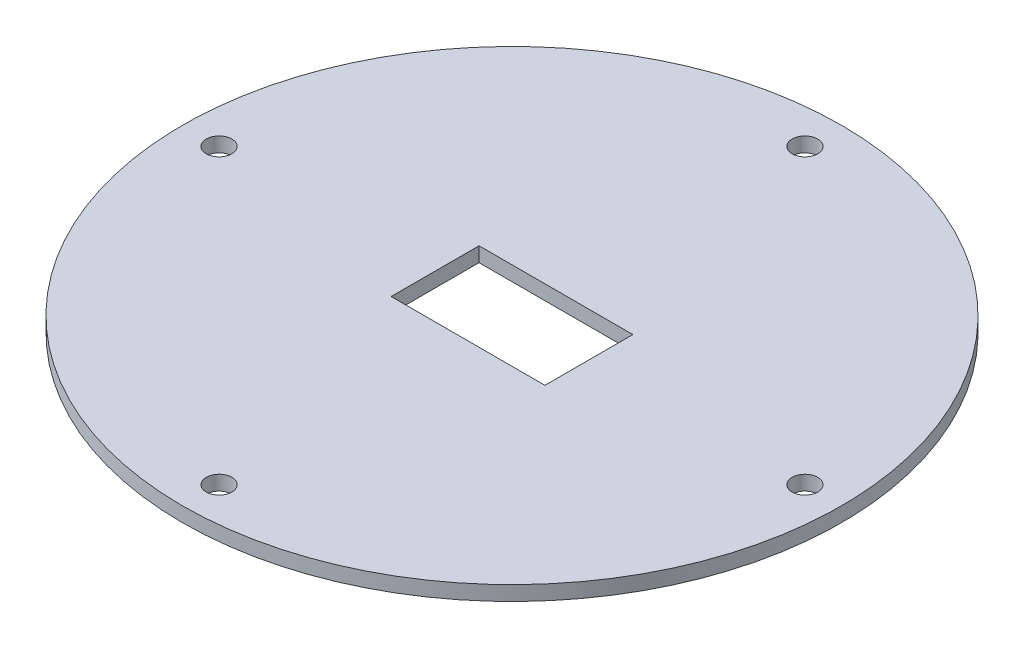
ISO-10303-21;
HEADER;
FILE_DESCRIPTION(('STEP AP214'),'2;1');
FILE_NAME('part.step','',(''),(''),'','','');
FILE_SCHEMA(('AUTOMOTIVE_DESIGN { 1 0 10303 214 1 1 1 1 }'));
ENDSEC;
DATA;
#1=APPLICATION_CONTEXT('core data for automotive mechanical design processes');
#2=APPLICATION_PROTOCOL_DEFINITION('international standard','automotive_design',2000,#1);
#3=PRODUCT_CONTEXT('',#1,'mechanical');
#4=PRODUCT('Part','Part','',(#3));
#5=PRODUCT_RELATED_PRODUCT_CATEGORY('part','',(#4));
#6=PRODUCT_DEFINITION_FORMATION('','',#4);
#7=PRODUCT_DEFINITION_CONTEXT('part definition',#1,'design');
#8=PRODUCT_DEFINITION('design','',#6,#7);
#9=PRODUCT_DEFINITION_SHAPE('','',#8);
#10=(LENGTH_UNIT() NAMED_UNIT(*) SI_UNIT(.MILLI.,.METRE.));
#11=(NAMED_UNIT(*) PLANE_ANGLE_UNIT() SI_UNIT($,.RADIAN.));
#12=(NAMED_UNIT(*) SI_UNIT($,.STERADIAN.) SOLID_ANGLE_UNIT());
#13=UNCERTAINTY_MEASURE_WITH_UNIT(LENGTH_MEASURE(1.E-05),#10,'distance_accuracy_value','');
#14=(GEOMETRIC_REPRESENTATION_CONTEXT(3) GLOBAL_UNCERTAINTY_ASSIGNED_CONTEXT((#13)) GLOBAL_UNIT_ASSIGNED_CONTEXT((#10,
#11,#12)) REPRESENTATION_CONTEXT('',''));
#15=CARTESIAN_POINT('',(0.,0.,0.));
#16=DIRECTION('',(0.,0.,1.));
#17=DIRECTION('',(1.,0.,0.));
#18=AXIS2_PLACEMENT_3D('',#15,#16,#17);
#19=CARTESIAN_POINT('',(0.,2.,0.));
#20=DIRECTION('',(0.,-1.,0.));
#21=DIRECTION('',(0.,0.,-1.));
#22=AXIS2_PLACEMENT_3D('',#19,#20,#21);
#23=CYLINDRICAL_SURFACE('',#22,45.);
#24=CARTESIAN_POINT('',(0.,2.,0.));
#25=DIRECTION('',(0.,1.,0.));
#26=DIRECTION('',(0.,0.,1.));
#27=AXIS2_PLACEMENT_3D('',#24,#25,#26);
#28=CIRCLE('',#27,45.);
#29=CARTESIAN_POINT('',(0.,2.,45.));
#30=VERTEX_POINT('',#29);
#31=EDGE_CURVE('E11',#30,#30,#28,.T.);
#32=ORIENTED_EDGE('',*,*,#31,.F.);
#33=EDGE_LOOP('',(#32));
#34=FACE_BOUND('',#33,.T.);
#35=CARTESIAN_POINT('',(0.,0.,0.));
#36=DIRECTION('',(0.,1.,0.));
#37=DIRECTION('',(0.,0.,1.));
#38=AXIS2_PLACEMENT_3D('',#35,#36,#37);
#39=CIRCLE('',#38,45.);
#40=CARTESIAN_POINT('',(0.,0.,45.));
#41=VERTEX_POINT('',#40);
#42=EDGE_CURVE('E36',#41,#41,#39,.T.);
#43=ORIENTED_EDGE('',*,*,#42,.T.);
#44=EDGE_LOOP('',(#43));
#45=FACE_BOUND('',#44,.T.);
#46=ADVANCED_FACE('F33',(#34,#45),#23,.T.);
#47=CARTESIAN_POINT('',(0.,2.,0.));
#48=DIRECTION('',(0.,1.,0.));
#49=DIRECTION('',(0.,0.,1.));
#50=AXIS2_PLACEMENT_3D('',#47,#48,#49);
#51=PLANE('',#50);
#52=DIRECTION('',(0.,0.,-1.));
#53=VECTOR('',#52,1.);
#54=CARTESIAN_POINT('',(10.5,2.,6.));
#55=LINE('',#54,#53);
#56=CARTESIAN_POINT('',(10.5,2.,6.));
#57=VERTEX_POINT('',#56);
#58=CARTESIAN_POINT('',(10.5,2.,-6.));
#59=VERTEX_POINT('',#58);
#60=EDGE_CURVE('E47',#57,#59,#55,.T.);
#61=ORIENTED_EDGE('',*,*,#60,.F.);
#62=DIRECTION('',(1.,0.,0.));
#63=VECTOR('',#62,1.);
#64=CARTESIAN_POINT('',(-10.5,2.,6.));
#65=LINE('',#64,#63);
#66=CARTESIAN_POINT('',(-10.5,2.,6.));
#67=VERTEX_POINT('',#66);
#68=EDGE_CURVE('E91',#67,#57,#65,.T.);
#69=ORIENTED_EDGE('',*,*,#68,.F.);
#70=DIRECTION('',(0.,0.,1.));
#71=VECTOR('',#70,1.);
#72=CARTESIAN_POINT('',(-10.5,2.,6.));
#73=LINE('',#72,#71);
#74=CARTESIAN_POINT('',(-10.5,2.,-6.));
#75=VERTEX_POINT('',#74);
#76=EDGE_CURVE('E94',#75,#67,#73,.T.);
#77=ORIENTED_EDGE('',*,*,#76,.F.);
#78=DIRECTION('',(-1.,0.,0.));
#79=VECTOR('',#78,1.);
#80=CARTESIAN_POINT('',(-10.5,2.,-6.));
#81=LINE('',#80,#79);
#82=EDGE_CURVE('E100',#59,#75,#81,.T.);
#83=ORIENTED_EDGE('',*,*,#82,.F.);
#84=EDGE_LOOP('',(#61,#69,#77,#83));
#85=FACE_BOUND('',#84,.T.);
#86=CARTESIAN_POINT('',(0.,2.,-40.));
#87=DIRECTION('',(0.,1.,0.));
#88=DIRECTION('',(0.,0.,1.));
#89=AXIS2_PLACEMENT_3D('',#86,#87,#88);
#90=CIRCLE('',#89,1.75);
#91=CARTESIAN_POINT('',(0.,2.,-38.25));
#92=VERTEX_POINT('',#91);
#93=EDGE_CURVE('E113',#92,#92,#90,.T.);
#94=ORIENTED_EDGE('',*,*,#93,.F.);
#95=EDGE_LOOP('',(#94));
#96=FACE_BOUND('',#95,.T.);
#97=CARTESIAN_POINT('',(40.,2.,0.));
#98=DIRECTION('',(0.,1.,0.));
#99=DIRECTION('',(0.,0.,1.));
#100=AXIS2_PLACEMENT_3D('',#97,#98,#99);
#101=CIRCLE('',#100,1.75);
#102=CARTESIAN_POINT('',(40.,2.,1.75));
#103=VERTEX_POINT('',#102);
#104=EDGE_CURVE('E119',#103,#103,#101,.T.);
#105=ORIENTED_EDGE('',*,*,#104,.F.);
#106=EDGE_LOOP('',(#105));
#107=FACE_BOUND('',#106,.T.);
#108=CARTESIAN_POINT('',(0.,2.,40.));
#109=DIRECTION('',(0.,1.,0.));
#110=DIRECTION('',(0.,0.,1.));
#111=AXIS2_PLACEMENT_3D('',#108,#109,#110);
#112=CIRCLE('',#111,1.75);
#113=CARTESIAN_POINT('',(0.,2.,41.75));
#114=VERTEX_POINT('',#113);
#115=EDGE_CURVE('E125',#114,#114,#112,.T.);
#116=ORIENTED_EDGE('',*,*,#115,.F.);
#117=EDGE_LOOP('',(#116));
#118=FACE_BOUND('',#117,.T.);
#119=CARTESIAN_POINT('',(-40.,2.,0.));
#120=DIRECTION('',(0.,1.,0.));
#121=DIRECTION('',(0.,0.,1.));
#122=AXIS2_PLACEMENT_3D('',#119,#120,#121);
#123=CIRCLE('',#122,1.75);
#124=CARTESIAN_POINT('',(-40.,2.,1.75));
#125=VERTEX_POINT('',#124);
#126=EDGE_CURVE('E106',#125,#125,#123,.T.);
#127=ORIENTED_EDGE('',*,*,#126,.F.);
#128=EDGE_LOOP('',(#127));
#129=FACE_BOUND('',#128,.T.);
#130=ORIENTED_EDGE('',*,*,#31,.T.);
#131=EDGE_LOOP('',(#130));
#132=FACE_BOUND('',#131,.T.);
#133=ADVANCED_FACE('F136',(#85,#96,#107,#118,#129,#132),#51,.T.);
#134=CARTESIAN_POINT('',(0.,0.,0.));
#135=DIRECTION('',(0.,1.,0.));
#136=DIRECTION('',(0.,0.,1.));
#137=AXIS2_PLACEMENT_3D('',#134,#135,#136);
#138=PLANE('',#137);
#139=DIRECTION('',(1.,0.,0.));
#140=VECTOR('',#139,1.);
#141=CARTESIAN_POINT('',(-10.5,0.,6.));
#142=LINE('',#141,#140);
#143=CARTESIAN_POINT('',(-10.5,0.,6.));
#144=VERTEX_POINT('',#143);
#145=CARTESIAN_POINT('',(10.5,0.,6.));
#146=VERTEX_POINT('',#145);
#147=EDGE_CURVE('E81',#144,#146,#142,.T.);
#148=ORIENTED_EDGE('',*,*,#147,.T.);
#149=DIRECTION('',(0.,0.,-1.));
#150=VECTOR('',#149,1.);
#151=CARTESIAN_POINT('',(10.5,0.,6.));
#152=LINE('',#151,#150);
#153=CARTESIAN_POINT('',(10.5,0.,-6.));
#154=VERTEX_POINT('',#153);
#155=EDGE_CURVE('E75',#146,#154,#152,.T.);
#156=ORIENTED_EDGE('',*,*,#155,.T.);
#157=DIRECTION('',(-1.,0.,0.));
#158=VECTOR('',#157,1.);
#159=CARTESIAN_POINT('',(-10.5,0.,-6.));
#160=LINE('',#159,#158);
#161=CARTESIAN_POINT('',(-10.5,0.,-6.));
#162=VERTEX_POINT('',#161);
#163=EDGE_CURVE('E84',#154,#162,#160,.T.);
#164=ORIENTED_EDGE('',*,*,#163,.T.);
#165=DIRECTION('',(0.,0.,1.));
#166=VECTOR('',#165,1.);
#167=CARTESIAN_POINT('',(-10.5,0.,6.));
#168=LINE('',#167,#166);
#169=EDGE_CURVE('E55',#162,#144,#168,.T.);
#170=ORIENTED_EDGE('',*,*,#169,.T.);
#171=EDGE_LOOP('',(#148,#156,#164,#170));
#172=FACE_BOUND('',#171,.T.);
#173=CARTESIAN_POINT('',(0.,0.,-40.));
#174=DIRECTION('',(0.,1.,0.));
#175=DIRECTION('',(0.,0.,1.));
#176=AXIS2_PLACEMENT_3D('',#173,#174,#175);
#177=CIRCLE('',#176,1.75);
#178=CARTESIAN_POINT('',(0.,0.,-38.25));
#179=VERTEX_POINT('',#178);
#180=EDGE_CURVE('E110',#179,#179,#177,.T.);
#181=ORIENTED_EDGE('',*,*,#180,.T.);
#182=EDGE_LOOP('',(#181));
#183=FACE_BOUND('',#182,.T.);
#184=CARTESIAN_POINT('',(40.,0.,0.));
#185=DIRECTION('',(0.,1.,0.));
#186=DIRECTION('',(0.,0.,1.));
#187=AXIS2_PLACEMENT_3D('',#184,#185,#186);
#188=CIRCLE('',#187,1.75);
#189=CARTESIAN_POINT('',(40.,0.,1.75));
#190=VERTEX_POINT('',#189);
#191=EDGE_CURVE('E116',#190,#190,#188,.T.);
#192=ORIENTED_EDGE('',*,*,#191,.T.);
#193=EDGE_LOOP('',(#192));
#194=FACE_BOUND('',#193,.T.);
#195=CARTESIAN_POINT('',(0.,0.,40.));
#196=DIRECTION('',(0.,1.,0.));
#197=DIRECTION('',(0.,0.,1.));
#198=AXIS2_PLACEMENT_3D('',#195,#196,#197);
#199=CIRCLE('',#198,1.75);
#200=CARTESIAN_POINT('',(0.,0.,41.75));
#201=VERTEX_POINT('',#200);
#202=EDGE_CURVE('E122',#201,#201,#199,.T.);
#203=ORIENTED_EDGE('',*,*,#202,.T.);
#204=EDGE_LOOP('',(#203));
#205=FACE_BOUND('',#204,.T.);
#206=CARTESIAN_POINT('',(-40.,0.,0.));
#207=DIRECTION('',(0.,1.,0.));
#208=DIRECTION('',(0.,0.,1.));
#209=AXIS2_PLACEMENT_3D('',#206,#207,#208);
#210=CIRCLE('',#209,1.75);
#211=CARTESIAN_POINT('',(-40.,0.,1.75));
#212=VERTEX_POINT('',#211);
#213=EDGE_CURVE('E128',#212,#212,#210,.T.);
#214=ORIENTED_EDGE('',*,*,#213,.T.);
#215=EDGE_LOOP('',(#214));
#216=FACE_BOUND('',#215,.T.);
#217=ORIENTED_EDGE('',*,*,#42,.F.);
#218=EDGE_LOOP('',(#217));
#219=FACE_BOUND('',#218,.T.);
#220=ADVANCED_FACE('F88',(#172,#183,#194,#205,#216,#219),#138,.F.);
#221=CARTESIAN_POINT('',(-40.,0.,0.));
#222=DIRECTION('',(0.,1.,0.));
#223=DIRECTION('',(0.,0.,1.));
#224=AXIS2_PLACEMENT_3D('',#221,#222,#223);
#225=CYLINDRICAL_SURFACE('',#224,1.75);
#226=ORIENTED_EDGE('',*,*,#213,.F.);
#227=EDGE_LOOP('',(#226));
#228=FACE_BOUND('',#227,.T.);
#229=ORIENTED_EDGE('',*,*,#126,.T.);
#230=EDGE_LOOP('',(#229));
#231=FACE_BOUND('',#230,.T.);
#232=ADVANCED_FACE('F134',(#228,#231),#225,.F.);
#233=CARTESIAN_POINT('',(0.,0.,40.));
#234=DIRECTION('',(0.,1.,0.));
#235=DIRECTION('',(0.,0.,1.));
#236=AXIS2_PLACEMENT_3D('',#233,#234,#235);
#237=CYLINDRICAL_SURFACE('',#236,1.75);
#238=ORIENTED_EDGE('',*,*,#202,.F.);
#239=EDGE_LOOP('',(#238));
#240=FACE_BOUND('',#239,.T.);
#241=ORIENTED_EDGE('',*,*,#115,.T.);
#242=EDGE_LOOP('',(#241));
#243=FACE_BOUND('',#242,.T.);
#244=ADVANCED_FACE('F152',(#240,#243),#237,.F.);
#245=CARTESIAN_POINT('',(40.,0.,0.));
#246=DIRECTION('',(0.,1.,0.));
#247=DIRECTION('',(0.,0.,1.));
#248=AXIS2_PLACEMENT_3D('',#245,#246,#247);
#249=CYLINDRICAL_SURFACE('',#248,1.75);
#250=ORIENTED_EDGE('',*,*,#191,.F.);
#251=EDGE_LOOP('',(#250));
#252=FACE_BOUND('',#251,.T.);
#253=ORIENTED_EDGE('',*,*,#104,.T.);
#254=EDGE_LOOP('',(#253));
#255=FACE_BOUND('',#254,.T.);
#256=ADVANCED_FACE('F158',(#252,#255),#249,.F.);
#257=CARTESIAN_POINT('',(0.,0.,-40.));
#258=DIRECTION('',(0.,1.,0.));
#259=DIRECTION('',(0.,0.,1.));
#260=AXIS2_PLACEMENT_3D('',#257,#258,#259);
#261=CYLINDRICAL_SURFACE('',#260,1.75);
#262=ORIENTED_EDGE('',*,*,#180,.F.);
#263=EDGE_LOOP('',(#262));
#264=FACE_BOUND('',#263,.T.);
#265=ORIENTED_EDGE('',*,*,#93,.T.);
#266=EDGE_LOOP('',(#265));
#267=FACE_BOUND('',#266,.T.);
#268=ADVANCED_FACE('F162',(#264,#267),#261,.F.);
#269=CARTESIAN_POINT('',(10.5,0.,6.));
#270=DIRECTION('',(1.,0.,0.));
#271=DIRECTION('',(0.,0.,-1.));
#272=AXIS2_PLACEMENT_3D('',#269,#270,#271);
#273=PLANE('',#272);
#274=ORIENTED_EDGE('',*,*,#60,.T.);
#275=DIRECTION('',(0.,1.,0.));
#276=VECTOR('',#275,1.);
#277=CARTESIAN_POINT('',(10.5,0.,-6.));
#278=LINE('',#277,#276);
#279=EDGE_CURVE('E71',#154,#59,#278,.T.);
#280=ORIENTED_EDGE('',*,*,#279,.F.);
#281=ORIENTED_EDGE('',*,*,#155,.F.);
#282=DIRECTION('',(0.,1.,0.));
#283=VECTOR('',#282,1.);
#284=CARTESIAN_POINT('',(10.5,0.,6.));
#285=LINE('',#284,#283);
#286=EDGE_CURVE('E104',#146,#57,#285,.T.);
#287=ORIENTED_EDGE('',*,*,#286,.T.);
#288=EDGE_LOOP('',(#274,#280,#281,#287));
#289=FACE_BOUND('',#288,.T.);
#290=ADVANCED_FACE('F73',(#289),#273,.F.);
#291=CARTESIAN_POINT('',(-10.5,0.,6.));
#292=DIRECTION('',(0.,0.,1.));
#293=DIRECTION('',(1.,0.,0.));
#294=AXIS2_PLACEMENT_3D('',#291,#292,#293);
#295=PLANE('',#294);
#296=ORIENTED_EDGE('',*,*,#68,.T.);
#297=ORIENTED_EDGE('',*,*,#286,.F.);
#298=ORIENTED_EDGE('',*,*,#147,.F.);
#299=DIRECTION('',(0.,1.,0.));
#300=VECTOR('',#299,1.);
#301=CARTESIAN_POINT('',(-10.5,0.,6.));
#302=LINE('',#301,#300);
#303=EDGE_CURVE('E107',#144,#67,#302,.T.);
#304=ORIENTED_EDGE('',*,*,#303,.T.);
#305=EDGE_LOOP('',(#296,#297,#298,#304));
#306=FACE_BOUND('',#305,.T.);
#307=ADVANCED_FACE('F169',(#306),#295,.F.);
#308=CARTESIAN_POINT('',(-10.5,0.,6.));
#309=DIRECTION('',(-1.,0.,0.));
#310=DIRECTION('',(0.,0.,1.));
#311=AXIS2_PLACEMENT_3D('',#308,#309,#310);
#312=PLANE('',#311);
#313=ORIENTED_EDGE('',*,*,#76,.T.);
#314=ORIENTED_EDGE('',*,*,#303,.F.);
#315=ORIENTED_EDGE('',*,*,#169,.F.);
#316=DIRECTION('',(0.,1.,0.));
#317=VECTOR('',#316,1.);
#318=CARTESIAN_POINT('',(-10.5,0.,-6.));
#319=LINE('',#318,#317);
#320=EDGE_CURVE('E80',#162,#75,#319,.T.);
#321=ORIENTED_EDGE('',*,*,#320,.T.);
#322=EDGE_LOOP('',(#313,#314,#315,#321));
#323=FACE_BOUND('',#322,.T.);
#324=ADVANCED_FACE('F172',(#323),#312,.F.);
#325=CARTESIAN_POINT('',(-10.5,0.,-6.));
#326=DIRECTION('',(0.,0.,-1.));
#327=DIRECTION('',(-1.,0.,0.));
#328=AXIS2_PLACEMENT_3D('',#325,#326,#327);
#329=PLANE('',#328);
#330=ORIENTED_EDGE('',*,*,#82,.T.);
#331=ORIENTED_EDGE('',*,*,#320,.F.);
#332=ORIENTED_EDGE('',*,*,#163,.F.);
#333=ORIENTED_EDGE('',*,*,#279,.T.);
#334=EDGE_LOOP('',(#330,#331,#332,#333));
#335=FACE_BOUND('',#334,.T.);
#336=ADVANCED_FACE('F85',(#335),#329,.F.);
#337=CLOSED_SHELL('',(#46,#133,#220,#232,#244,#256,#268,#290,#307,#324,#336));
#338=MANIFOLD_SOLID_BREP('B2',#337);
#339=ADVANCED_BREP_SHAPE_REPRESENTATION('',(#18,#338),#14);
#340=SHAPE_DEFINITION_REPRESENTATION(#9,#339);
ENDSEC;
END-ISO-10303-21;
